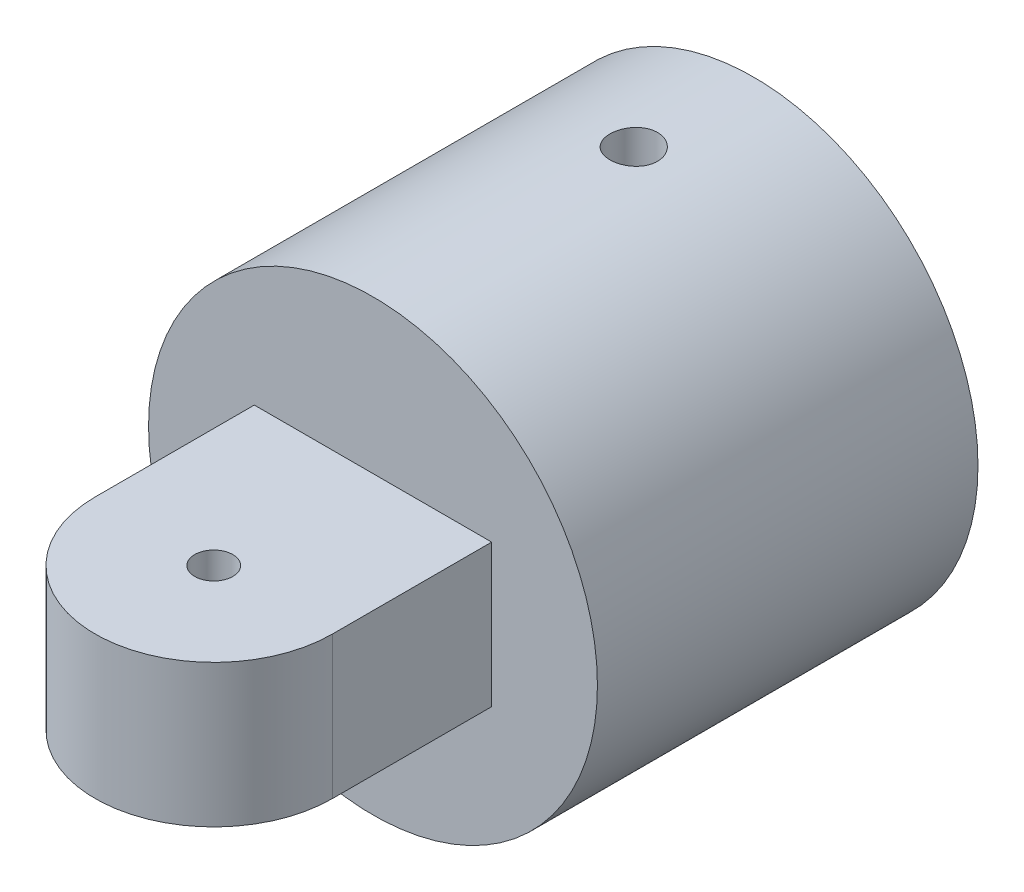
ISO-10303-21;
HEADER;
FILE_DESCRIPTION(('STEP AP214'),'2;1');
FILE_NAME('part.step','',(''),(''),'','','');
FILE_SCHEMA(('AUTOMOTIVE_DESIGN { 1 0 10303 214 1 1 1 1 }'));
ENDSEC;
DATA;
#1=APPLICATION_CONTEXT('core data for automotive mechanical design processes');
#2=APPLICATION_PROTOCOL_DEFINITION('international standard','automotive_design',2000,#1);
#3=PRODUCT_CONTEXT('',#1,'mechanical');
#4=PRODUCT('Part','Part','',(#3));
#5=PRODUCT_RELATED_PRODUCT_CATEGORY('part','',(#4));
#6=PRODUCT_DEFINITION_FORMATION('','',#4);
#7=PRODUCT_DEFINITION_CONTEXT('part definition',#1,'design');
#8=PRODUCT_DEFINITION('design','',#6,#7);
#9=PRODUCT_DEFINITION_SHAPE('','',#8);
#10=(LENGTH_UNIT() NAMED_UNIT(*) SI_UNIT(.MILLI.,.METRE.));
#11=(NAMED_UNIT(*) PLANE_ANGLE_UNIT() SI_UNIT($,.RADIAN.));
#12=(NAMED_UNIT(*) SI_UNIT($,.STERADIAN.) SOLID_ANGLE_UNIT());
#13=UNCERTAINTY_MEASURE_WITH_UNIT(LENGTH_MEASURE(1.E-05),#10,'distance_accuracy_value','');
#14=(GEOMETRIC_REPRESENTATION_CONTEXT(3) GLOBAL_UNCERTAINTY_ASSIGNED_CONTEXT((#13)) GLOBAL_UNIT_ASSIGNED_CONTEXT((#10,
#11,#12)) REPRESENTATION_CONTEXT('',''));
#15=CARTESIAN_POINT('',(0.,0.,0.));
#16=DIRECTION('',(0.,0.,1.));
#17=DIRECTION('',(1.,0.,0.));
#18=AXIS2_PLACEMENT_3D('',#15,#16,#17);
#19=CARTESIAN_POINT('',(0.,7.49,46.7347256348819));
#20=DIRECTION('',(0.,-1.,0.));
#21=DIRECTION('',(0.,0.,-1.));
#22=AXIS2_PLACEMENT_3D('',#19,#20,#21);
#23=CYLINDRICAL_SURFACE('',#22,12.4735073454206);
#24=CARTESIAN_POINT('',(0.,-7.49,46.7347256348819));
#25=DIRECTION('',(0.,1.,0.));
#26=DIRECTION('',(0.,0.,1.));
#27=AXIS2_PLACEMENT_3D('',#24,#25,#26);
#28=CIRCLE('',#27,12.4735073454206);
#29=CARTESIAN_POINT('',(-12.4735073454206,-7.49,46.7347256348819));
#30=VERTEX_POINT('',#29);
#31=CARTESIAN_POINT('',(12.4735073454206,-7.49,46.7347256348819));
#32=VERTEX_POINT('',#31);
#33=EDGE_CURVE('E107',#30,#32,#28,.T.);
#34=ORIENTED_EDGE('',*,*,#33,.T.);
#35=DIRECTION('',(0.,-1.,0.));
#36=VECTOR('',#35,1.);
#37=CARTESIAN_POINT('',(12.4735073454206,7.49,46.7347256348819));
#38=LINE('',#37,#36);
#39=CARTESIAN_POINT('',(12.4735073454206,7.49,46.7347256348819));
#40=VERTEX_POINT('',#39);
#41=EDGE_CURVE('E12',#40,#32,#38,.T.);
#42=ORIENTED_EDGE('',*,*,#41,.F.);
#43=CARTESIAN_POINT('',(0.,7.49,46.7347256348819));
#44=DIRECTION('',(0.,1.,0.));
#45=DIRECTION('',(0.,0.,1.));
#46=AXIS2_PLACEMENT_3D('',#43,#44,#45);
#47=CIRCLE('',#46,12.4735073454206);
#48=CARTESIAN_POINT('',(-12.4735073454206,7.49,46.7347256348819));
#49=VERTEX_POINT('',#48);
#50=EDGE_CURVE('E94',#49,#40,#47,.T.);
#51=ORIENTED_EDGE('',*,*,#50,.F.);
#52=DIRECTION('',(0.,-1.,0.));
#53=VECTOR('',#52,1.);
#54=CARTESIAN_POINT('',(-12.4735073454206,7.49,46.7347256348819));
#55=LINE('',#54,#53);
#56=EDGE_CURVE('E103',#49,#30,#55,.T.);
#57=ORIENTED_EDGE('',*,*,#56,.T.);
#58=EDGE_LOOP('',(#34,#42,#51,#57));
#59=FACE_BOUND('',#58,.T.);
#60=ADVANCED_FACE('F42',(#59),#23,.T.);
#61=CARTESIAN_POINT('',(12.4735073454206,7.49,46.7347256348819));
#62=DIRECTION('',(-1.,0.,0.));
#63=DIRECTION('',(0.,0.,1.));
#64=AXIS2_PLACEMENT_3D('',#61,#62,#63);
#65=PLANE('',#64);
#66=DIRECTION('',(0.,0.,-1.));
#67=VECTOR('',#66,1.);
#68=CARTESIAN_POINT('',(12.4735073454206,-7.49,46.7347256348819));
#69=LINE('',#68,#67);
#70=CARTESIAN_POINT('',(12.4735073454206,-7.49,30.));
#71=VERTEX_POINT('',#70);
#72=EDGE_CURVE('E98',#32,#71,#69,.T.);
#73=ORIENTED_EDGE('',*,*,#72,.T.);
#74=DIRECTION('',(0.,-1.,0.));
#75=VECTOR('',#74,1.);
#76=CARTESIAN_POINT('',(12.4735073454206,7.49,30.));
#77=LINE('',#76,#75);
#78=CARTESIAN_POINT('',(12.4735073454206,7.49,30.));
#79=VERTEX_POINT('',#78);
#80=EDGE_CURVE('E51',#79,#71,#77,.T.);
#81=ORIENTED_EDGE('',*,*,#80,.F.);
#82=DIRECTION('',(0.,0.,-1.));
#83=VECTOR('',#82,1.);
#84=CARTESIAN_POINT('',(12.4735073454206,7.49,46.7347256348819));
#85=LINE('',#84,#83);
#86=EDGE_CURVE('E89',#40,#79,#85,.T.);
#87=ORIENTED_EDGE('',*,*,#86,.F.);
#88=ORIENTED_EDGE('',*,*,#41,.T.);
#89=EDGE_LOOP('',(#73,#81,#87,#88));
#90=FACE_BOUND('',#89,.T.);
#91=ADVANCED_FACE('F97',(#90),#65,.F.);
#92=CARTESIAN_POINT('',(-12.4735073454206,7.49,30.));
#93=DIRECTION('',(0.,0.,1.));
#94=DIRECTION('',(1.,0.,0.));
#95=AXIS2_PLACEMENT_3D('',#92,#93,#94);
#96=PLANE('',#95);
#97=DIRECTION('',(-1.,0.,0.));
#98=VECTOR('',#97,1.);
#99=CARTESIAN_POINT('',(-12.4735073454206,-7.49,30.));
#100=LINE('',#99,#98);
#101=CARTESIAN_POINT('',(-12.4735073454206,-7.49,30.));
#102=VERTEX_POINT('',#101);
#103=EDGE_CURVE('E76',#71,#102,#100,.T.);
#104=ORIENTED_EDGE('',*,*,#103,.T.);
#105=DIRECTION('',(0.,-1.,0.));
#106=VECTOR('',#105,1.);
#107=CARTESIAN_POINT('',(-12.4735073454206,7.49,30.));
#108=LINE('',#107,#106);
#109=CARTESIAN_POINT('',(-12.4735073454206,7.49,30.));
#110=VERTEX_POINT('',#109);
#111=EDGE_CURVE('E99',#110,#102,#108,.T.);
#112=ORIENTED_EDGE('',*,*,#111,.F.);
#113=DIRECTION('',(-1.,0.,0.));
#114=VECTOR('',#113,1.);
#115=CARTESIAN_POINT('',(-12.4735073454206,7.49,30.));
#116=LINE('',#115,#114);
#117=EDGE_CURVE('E92',#79,#110,#116,.T.);
#118=ORIENTED_EDGE('',*,*,#117,.F.);
#119=ORIENTED_EDGE('',*,*,#80,.T.);
#120=EDGE_LOOP('',(#104,#112,#118,#119));
#121=FACE_BOUND('',#120,.T.);
#122=ADVANCED_FACE('F101',(#121),#96,.F.);
#123=CARTESIAN_POINT('',(-12.4735073454206,7.49,30.));
#124=DIRECTION('',(1.,0.,0.));
#125=DIRECTION('',(0.,0.,-1.));
#126=AXIS2_PLACEMENT_3D('',#123,#124,#125);
#127=PLANE('',#126);
#128=DIRECTION('',(0.,0.,1.));
#129=VECTOR('',#128,1.);
#130=CARTESIAN_POINT('',(-12.4735073454206,-7.49,30.));
#131=LINE('',#130,#129);
#132=EDGE_CURVE('E82',#102,#30,#131,.T.);
#133=ORIENTED_EDGE('',*,*,#132,.T.);
#134=ORIENTED_EDGE('',*,*,#56,.F.);
#135=DIRECTION('',(0.,0.,1.));
#136=VECTOR('',#135,1.);
#137=CARTESIAN_POINT('',(-12.4735073454206,7.49,30.));
#138=LINE('',#137,#136);
#139=EDGE_CURVE('E59',#110,#49,#138,.T.);
#140=ORIENTED_EDGE('',*,*,#139,.F.);
#141=ORIENTED_EDGE('',*,*,#111,.T.);
#142=EDGE_LOOP('',(#133,#134,#140,#141));
#143=FACE_BOUND('',#142,.T.);
#144=ADVANCED_FACE('F115',(#143),#127,.F.);
#145=CARTESIAN_POINT('',(0.,7.49,46.7347256348819));
#146=DIRECTION('',(0.,1.,0.));
#147=DIRECTION('',(0.,0.,1.));
#148=AXIS2_PLACEMENT_3D('',#145,#146,#147);
#149=PLANE('',#148);
#150=CARTESIAN_POINT('',(0.,7.49,46.7347256348819));
#151=DIRECTION('',(0.,1.,0.));
#152=DIRECTION('',(0.,0.,1.));
#153=AXIS2_PLACEMENT_3D('',#150,#151,#152);
#154=CIRCLE('',#153,2.);
#155=CARTESIAN_POINT('',(0.,7.49,48.7347256348819));
#156=VERTEX_POINT('',#155);
#157=EDGE_CURVE('E110',#156,#156,#154,.T.);
#158=ORIENTED_EDGE('',*,*,#157,.F.);
#159=EDGE_LOOP('',(#158));
#160=FACE_BOUND('',#159,.T.);
#161=ORIENTED_EDGE('',*,*,#50,.T.);
#162=ORIENTED_EDGE('',*,*,#86,.T.);
#163=ORIENTED_EDGE('',*,*,#117,.T.);
#164=ORIENTED_EDGE('',*,*,#139,.T.);
#165=EDGE_LOOP('',(#161,#162,#163,#164));
#166=FACE_BOUND('',#165,.T.);
#167=ADVANCED_FACE('F90',(#160,#166),#149,.T.);
#168=CARTESIAN_POINT('',(0.,-7.49,46.7347256348819));
#169=DIRECTION('',(0.,1.,0.));
#170=DIRECTION('',(0.,0.,1.));
#171=AXIS2_PLACEMENT_3D('',#168,#169,#170);
#172=PLANE('',#171);
#173=CARTESIAN_POINT('',(0.,-7.49,46.7347256348819));
#174=DIRECTION('',(0.,1.,0.));
#175=DIRECTION('',(0.,0.,1.));
#176=AXIS2_PLACEMENT_3D('',#173,#174,#175);
#177=CIRCLE('',#176,2.);
#178=CARTESIAN_POINT('',(0.,-7.49,48.7347256348819));
#179=VERTEX_POINT('',#178);
#180=EDGE_CURVE('E45',#179,#179,#177,.T.);
#181=ORIENTED_EDGE('',*,*,#180,.T.);
#182=EDGE_LOOP('',(#181));
#183=FACE_BOUND('',#182,.T.);
#184=ORIENTED_EDGE('',*,*,#33,.F.);
#185=ORIENTED_EDGE('',*,*,#132,.F.);
#186=ORIENTED_EDGE('',*,*,#103,.F.);
#187=ORIENTED_EDGE('',*,*,#72,.F.);
#188=EDGE_LOOP('',(#184,#185,#186,#187));
#189=FACE_BOUND('',#188,.T.);
#190=ADVANCED_FACE('F118',(#183,#189),#172,.F.);
#191=CARTESIAN_POINT('',(0.,-30.01,46.7347256348819));
#192=DIRECTION('',(0.,1.,0.));
#193=DIRECTION('',(0.,0.,1.));
#194=AXIS2_PLACEMENT_3D('',#191,#192,#193);
#195=CYLINDRICAL_SURFACE('',#194,2.);
#196=ORIENTED_EDGE('',*,*,#157,.T.);
#197=EDGE_LOOP('',(#196));
#198=FACE_BOUND('',#197,.T.);
#199=ORIENTED_EDGE('',*,*,#180,.F.);
#200=EDGE_LOOP('',(#199));
#201=FACE_BOUND('',#200,.T.);
#202=ADVANCED_FACE('F128',(#198,#201),#195,.F.);
#203=CLOSED_SHELL('',(#60,#91,#122,#144,#167,#190,#202));
#204=MANIFOLD_SOLID_BREP('B2',#203);
#205=CARTESIAN_POINT('',(0.,0.,-10.));
#206=DIRECTION('',(0.,0.,1.));
#207=DIRECTION('',(1.,0.,0.));
#208=AXIS2_PLACEMENT_3D('',#205,#206,#207);
#209=CYLINDRICAL_SURFACE('',#208,23.59);
#210=CARTESIAN_POINT('',(0.,-23.59,5.09265528024894));
#211=CARTESIAN_POINT('',(-0.140004890382727,-23.5899983030771,5.09264924055201));
#212=CARTESIAN_POINT('',(-0.280101235515981,-23.5887403958274,5.08085484903469));
#213=CARTESIAN_POINT('',(-0.556406756116709,-23.5838433207522,5.03398453755704));
#214=CARTESIAN_POINT('',(-0.69261152926387,-23.5802015594957,4.99888326108428));
#215=CARTESIAN_POINT('',(-0.957092956934866,-23.5709476853588,4.90643525755362));
#216=CARTESIAN_POINT('',(-1.0853744636063,-23.5653367927148,4.84910230477494));
#217=CARTESIAN_POINT('',(-1.33046665616082,-23.552771315274,4.7138459386785));
#218=CARTESIAN_POINT('',(-1.447279548038,-23.545816989654,4.63592649586781));
#219=CARTESIAN_POINT('',(-1.66661511804326,-23.5313118555805,4.46137336041841));
#220=CARTESIAN_POINT('',(-1.76908519934517,-23.5237590029897,4.36467374054453));
#221=CARTESIAN_POINT('',(-1.95637410950071,-23.5089248770597,4.15544610059121));
#222=CARTESIAN_POINT('',(-2.04119210452785,-23.501643616563,4.04291733321549));
#223=CARTESIAN_POINT('',(-2.19095784039705,-23.4881564147091,3.80489335893848));
#224=CARTESIAN_POINT('',(-2.25585757467481,-23.4819530867172,3.67936778530447));
#225=CARTESIAN_POINT('',(-2.36363798842801,-23.4713498936534,3.41912356710732));
#226=CARTESIAN_POINT('',(-2.40651927501024,-23.4669499788572,3.28440517613049));
#227=CARTESIAN_POINT('',(-2.46888865123076,-23.4604705499611,3.01013837871538));
#228=CARTESIAN_POINT('',(-2.48846438567586,-23.4583823443468,2.87061011186612));
#229=CARTESIAN_POINT('',(-2.50393796281383,-23.4567358887997,2.59023409604559));
#230=CARTESIAN_POINT('',(-2.49983649980298,-23.4571775646821,2.44938638588582));
#231=CARTESIAN_POINT('',(-2.46814427950293,-23.4605330256352,2.17097524294631));
#232=CARTESIAN_POINT('',(-2.44064940226408,-23.4634367197314,2.03340075715007));
#233=CARTESIAN_POINT('',(-2.36310010922259,-23.4713732901132,1.76482990985994));
#234=CARTESIAN_POINT('',(-2.31304535499427,-23.4764061983395,1.63383364708019));
#235=CARTESIAN_POINT('',(-2.19169195639642,-23.4880456955699,1.3818359671456));
#236=CARTESIAN_POINT('',(-2.12035096524796,-23.4946554161757,1.26085509326867));
#237=CARTESIAN_POINT('',(-1.95848059921138,-23.5087011989002,1.03254726176001));
#238=CARTESIAN_POINT('',(-1.86795059325972,-23.5161372881916,0.925220753361215));
#239=CARTESIAN_POINT('',(-1.66973740575721,-23.5310428996824,0.726711240644872));
#240=CARTESIAN_POINT('',(-1.56197145460676,-23.538512404975,0.63561086068373));
#241=CARTESIAN_POINT('',(-1.3326323311139,-23.5526085089759,0.472780651845098));
#242=CARTESIAN_POINT('',(-1.21105914024982,-23.5592351065534,0.401050848952615));
#243=CARTESIAN_POINT('',(-0.95749788958243,-23.5709013286536,0.27900051713335));
#244=CARTESIAN_POINT('',(-0.825507692564153,-23.5759406264525,0.22868439517165));
#245=CARTESIAN_POINT('',(-0.554887088841686,-23.583861220576,0.150951369049361));
#246=CARTESIAN_POINT('',(-0.416256905405358,-23.5867425894063,0.123533695504974));
#247=CARTESIAN_POINT('',(-0.13700681251426,-23.5900133370954,0.0924811689670743));
#248=CARTESIAN_POINT('',(0.00360028917354455,-23.5904146578676,0.0887323439707742));
#249=CARTESIAN_POINT('',(0.283440751422993,-23.5887121615328,0.104824272167669));
#250=CARTESIAN_POINT('',(0.422674132839351,-23.5866083825154,0.124664666691008));
#251=CARTESIAN_POINT('',(0.695484265843108,-23.5801396699159,0.18727725423791));
#252=CARTESIAN_POINT('',(0.82907345030202,-23.5757800202398,0.229995867960536));
#253=CARTESIAN_POINT('',(1.08719009199438,-23.5652884237549,0.337097067031888));
#254=CARTESIAN_POINT('',(1.21171732245822,-23.5591564326133,0.401480194294606));
#255=CARTESIAN_POINT('',(1.44868911728913,-23.5457757711934,0.550363955467738));
#256=CARTESIAN_POINT('',(1.5610865587743,-23.5385229945229,0.634939217734632));
#257=CARTESIAN_POINT('',(1.77013069103516,-23.52372718167,0.821699778434905));
#258=CARTESIAN_POINT('',(1.86677693664698,-23.5161841372913,0.923885574413334));
#259=CARTESIAN_POINT('',(2.04197287593517,-23.5016218005983,1.14346488094225));
#260=CARTESIAN_POINT('',(2.12044760211723,-23.4946047560305,1.26091837610957));
#261=CARTESIAN_POINT('',(2.25655697915346,-23.4819237546767,1.50740420436788));
#262=CARTESIAN_POINT('',(2.31419194505344,-23.4762597774361,1.63643636238121));
#263=CARTESIAN_POINT('',(2.40686115244347,-23.4669405565708,1.90216301244972));
#264=CARTESIAN_POINT('',(2.44193948508609,-23.4632813962425,2.03884198511199));
#265=CARTESIAN_POINT('',(2.48864252138218,-23.4583741704025,2.31619086426492));
#266=CARTESIAN_POINT('',(2.50026798822697,-23.4571260264327,2.45686064073779));
#267=CARTESIAN_POINT('',(2.49972395442828,-23.4571839502349,2.73745278195374));
#268=CARTESIAN_POINT('',(2.48767221595611,-23.4584773771247,2.87737539246933));
#269=CARTESIAN_POINT('',(2.44036333007009,-23.4634457046064,3.15319587166051));
#270=CARTESIAN_POINT('',(2.40510616101156,-23.4671206074198,3.28909373658193));
#271=CARTESIAN_POINT('',(2.31242071265327,-23.4764342239078,3.55300292855398));
#272=CARTESIAN_POINT('',(2.25499638901096,-23.4820725871918,3.68101565795841));
#273=CARTESIAN_POINT('',(2.11961864177243,-23.4946785069669,3.9256051537143));
#274=CARTESIAN_POINT('',(2.04166525062716,-23.5016460613569,4.04218193814251));
#275=CARTESIAN_POINT('',(1.86700081845345,-23.5161668347073,4.2611937293086));
#276=CARTESIAN_POINT('',(1.77020196065382,-23.5237226921116,4.36355852869407));
#277=CARTESIAN_POINT('',(1.56077124206543,-23.538544757639,4.55064161485833));
#278=CARTESIAN_POINT('',(1.44813560849441,-23.5458108962116,4.63535568474797));
#279=CARTESIAN_POINT('',(1.20987998501282,-23.5592562744924,4.78492279755493));
#280=CARTESIAN_POINT('',(1.08422463280158,-23.5654324240323,4.84971974786155));
#281=CARTESIAN_POINT('',(0.82382941268191,-23.5759690180188,4.95720631284111));
#282=CARTESIAN_POINT('',(0.689099898452413,-23.5803314924243,4.99992065662569));
#283=CARTESIAN_POINT('',(0.461351179347136,-23.5856627304559,5.05147129320623));
#284=CARTESIAN_POINT('',(0.369783882248667,-23.5872815484788,5.06689395058982));
#285=CARTESIAN_POINT('',(0.185491103341335,-23.5894507428818,5.08748792056352));
#286=CARTESIAN_POINT('',(0.092765627062525,-23.5900011243616,5.09265928208253));
#287=CARTESIAN_POINT('',(0.,-23.59,5.09265528024894));
#288=B_SPLINE_CURVE_WITH_KNOTS('',3,(#210,#211,#212,#213,#214,#215,#216,#217,#218,#219,#220,
#221,#222,#223,#224,#225,#226,#227,#228,#229,#230,#231,#232,#233,#234,#235,#236,#237,#238,#239,
#240,#241,#242,#243,#244,#245,#246,#247,#248,#249,#250,#251,#252,#253,#254,#255,#256,#257,#258,
#259,#260,#261,#262,#263,#264,#265,#266,#267,#268,#269,#270,#271,#272,#273,#274,#275,#276,#277,
#278,#279,#280,#281,#282,#283,#284,#285,#286,#287),.UNSPECIFIED.,.T.,.F.,(4,2,2,2,2,2,2,2,2,2,2,
2,2,2,2,2,2,2,2,2,2,2,2,2,2,2,2,2,2,2,2,2,2,2,2,2,2,2,4),(0.,0.41967590487986,0.839809142071956,
1.25968248839799,1.67947491298238,2.10076854982229,2.52208208267318,2.94440322328858,
3.36671271876888,3.78742897392592,4.2081328923083,4.62712077768863,5.04611494860777,
5.46594828694184,5.88579543435547,6.30772288072299,6.72965089308983,7.15166569688249,
7.57366632048221,7.993633335554,8.41359396518424,8.8325753478515,9.25156721165667,
9.67213228156076,10.0927092355103,10.5149915581614,10.9372674966777,11.3587154885586,
11.7801497656706,12.1994932813853,12.6188371882399,13.038106299089,13.4573747471904,
13.878645816124,14.3000174147048,14.7225650736196,15.1446385137549,15.4227122595513,
15.7007846781132),.UNSPECIFIED.);
#289=CARTESIAN_POINT('',(0.,-23.59,5.09265528024894));
#290=VERTEX_POINT('',#289);
#291=EDGE_CURVE('E41',#290,#290,#288,.T.);
#292=ORIENTED_EDGE('',*,*,#291,.F.);
#293=EDGE_LOOP('',(#292));
#294=FACE_BOUND('',#293,.T.);
#295=CARTESIAN_POINT('',(0.,23.59,5.09265528024894));
#296=CARTESIAN_POINT('',(0.140004890382727,23.5899983030771,5.09264924055201));
#297=CARTESIAN_POINT('',(0.280101235515981,23.5887403958274,5.08085484903469));
#298=CARTESIAN_POINT('',(0.556406756116709,23.5838433207522,5.03398453755704));
#299=CARTESIAN_POINT('',(0.69261152926387,23.5802015594957,4.99888326108428));
#300=CARTESIAN_POINT('',(0.957092956934866,23.5709476853588,4.90643525755362));
#301=CARTESIAN_POINT('',(1.0853744636063,23.5653367927148,4.84910230477494));
#302=CARTESIAN_POINT('',(1.33046665616082,23.552771315274,4.7138459386785));
#303=CARTESIAN_POINT('',(1.447279548038,23.545816989654,4.63592649586781));
#304=CARTESIAN_POINT('',(1.66661511804326,23.5313118555805,4.46137336041841));
#305=CARTESIAN_POINT('',(1.76908519934517,23.5237590029897,4.36467374054453));
#306=CARTESIAN_POINT('',(1.95637410950071,23.5089248770597,4.15544610059121));
#307=CARTESIAN_POINT('',(2.04119210452785,23.501643616563,4.04291733321549));
#308=CARTESIAN_POINT('',(2.19095784039705,23.4881564147091,3.80489335893848));
#309=CARTESIAN_POINT('',(2.25585757467481,23.4819530867172,3.67936778530447));
#310=CARTESIAN_POINT('',(2.36363798842801,23.4713498936534,3.41912356710732));
#311=CARTESIAN_POINT('',(2.40651927501024,23.4669499788572,3.28440517613049));
#312=CARTESIAN_POINT('',(2.46888865123076,23.4604705499611,3.01013837871538));
#313=CARTESIAN_POINT('',(2.48846438567586,23.4583823443468,2.87061011186612));
#314=CARTESIAN_POINT('',(2.50393796281383,23.4567358887997,2.59023409604559));
#315=CARTESIAN_POINT('',(2.49983649980298,23.4571775646821,2.44938638588582));
#316=CARTESIAN_POINT('',(2.46814427950293,23.4605330256352,2.17097524294631));
#317=CARTESIAN_POINT('',(2.44064940226408,23.4634367197314,2.03340075715007));
#318=CARTESIAN_POINT('',(2.36310010922259,23.4713732901132,1.76482990985994));
#319=CARTESIAN_POINT('',(2.31304535499427,23.4764061983395,1.63383364708019));
#320=CARTESIAN_POINT('',(2.19169195639642,23.4880456955699,1.3818359671456));
#321=CARTESIAN_POINT('',(2.12035096524796,23.4946554161757,1.26085509326867));
#322=CARTESIAN_POINT('',(1.95848059921138,23.5087011989002,1.03254726176001));
#323=CARTESIAN_POINT('',(1.86795059325972,23.5161372881916,0.925220753361215));
#324=CARTESIAN_POINT('',(1.66973740575721,23.5310428996824,0.726711240644872));
#325=CARTESIAN_POINT('',(1.56197145460676,23.538512404975,0.63561086068373));
#326=CARTESIAN_POINT('',(1.3326323311139,23.5526085089759,0.472780651845098));
#327=CARTESIAN_POINT('',(1.21105914024982,23.5592351065534,0.401050848952615));
#328=CARTESIAN_POINT('',(0.95749788958243,23.5709013286536,0.27900051713335));
#329=CARTESIAN_POINT('',(0.825507692564153,23.5759406264525,0.22868439517165));
#330=CARTESIAN_POINT('',(0.554887088841686,23.583861220576,0.150951369049361));
#331=CARTESIAN_POINT('',(0.416256905405358,23.5867425894063,0.123533695504974));
#332=CARTESIAN_POINT('',(0.13700681251426,23.5900133370954,0.0924811689670743));
#333=CARTESIAN_POINT('',(-0.00360028917354455,23.5904146578676,0.0887323439707742));
#334=CARTESIAN_POINT('',(-0.283440751422993,23.5887121615328,0.104824272167669));
#335=CARTESIAN_POINT('',(-0.422674132839351,23.5866083825154,0.124664666691008));
#336=CARTESIAN_POINT('',(-0.695484265843108,23.5801396699159,0.18727725423791));
#337=CARTESIAN_POINT('',(-0.82907345030202,23.5757800202398,0.229995867960536));
#338=CARTESIAN_POINT('',(-1.08719009199438,23.5652884237549,0.337097067031888));
#339=CARTESIAN_POINT('',(-1.21171732245822,23.5591564326133,0.401480194294606));
#340=CARTESIAN_POINT('',(-1.44868911728913,23.5457757711934,0.550363955467738));
#341=CARTESIAN_POINT('',(-1.5610865587743,23.5385229945229,0.634939217734632));
#342=CARTESIAN_POINT('',(-1.77013069103516,23.52372718167,0.821699778434905));
#343=CARTESIAN_POINT('',(-1.86677693664698,23.5161841372913,0.923885574413334));
#344=CARTESIAN_POINT('',(-2.04197287593517,23.5016218005983,1.14346488094225));
#345=CARTESIAN_POINT('',(-2.12044760211723,23.4946047560305,1.26091837610957));
#346=CARTESIAN_POINT('',(-2.25655697915346,23.4819237546767,1.50740420436788));
#347=CARTESIAN_POINT('',(-2.31419194505344,23.4762597774361,1.63643636238121));
#348=CARTESIAN_POINT('',(-2.40686115244347,23.4669405565708,1.90216301244972));
#349=CARTESIAN_POINT('',(-2.44193948508609,23.4632813962425,2.03884198511199));
#350=CARTESIAN_POINT('',(-2.48864252138218,23.4583741704025,2.31619086426492));
#351=CARTESIAN_POINT('',(-2.50026798822697,23.4571260264327,2.45686064073779));
#352=CARTESIAN_POINT('',(-2.49972395442828,23.4571839502349,2.73745278195374));
#353=CARTESIAN_POINT('',(-2.48767221595611,23.4584773771247,2.87737539246933));
#354=CARTESIAN_POINT('',(-2.44036333007009,23.4634457046064,3.15319587166051));
#355=CARTESIAN_POINT('',(-2.40510616101156,23.4671206074198,3.28909373658193));
#356=CARTESIAN_POINT('',(-2.31242071265327,23.4764342239078,3.55300292855398));
#357=CARTESIAN_POINT('',(-2.25499638901096,23.4820725871918,3.68101565795841));
#358=CARTESIAN_POINT('',(-2.11961864177243,23.4946785069669,3.9256051537143));
#359=CARTESIAN_POINT('',(-2.04166525062716,23.5016460613569,4.04218193814251));
#360=CARTESIAN_POINT('',(-1.86700081845345,23.5161668347073,4.2611937293086));
#361=CARTESIAN_POINT('',(-1.77020196065382,23.5237226921116,4.36355852869407));
#362=CARTESIAN_POINT('',(-1.56077124206543,23.538544757639,4.55064161485833));
#363=CARTESIAN_POINT('',(-1.44813560849441,23.5458108962116,4.63535568474797));
#364=CARTESIAN_POINT('',(-1.20987998501282,23.5592562744924,4.78492279755493));
#365=CARTESIAN_POINT('',(-1.08422463280158,23.5654324240323,4.84971974786155));
#366=CARTESIAN_POINT('',(-0.82382941268191,23.5759690180188,4.95720631284111));
#367=CARTESIAN_POINT('',(-0.689099898452413,23.5803314924243,4.99992065662569));
#368=CARTESIAN_POINT('',(-0.461351179347136,23.5856627304559,5.05147129320623));
#369=CARTESIAN_POINT('',(-0.369783882248667,23.5872815484788,5.06689395058982));
#370=CARTESIAN_POINT('',(-0.185491103341335,23.5894507428818,5.08748792056352));
#371=CARTESIAN_POINT('',(-0.092765627062525,23.5900011243616,5.09265928208253));
#372=CARTESIAN_POINT('',(0.,23.59,5.09265528024894));
#373=B_SPLINE_CURVE_WITH_KNOTS('',3,(#295,#296,#297,#298,#299,#300,#301,#302,#303,#304,#305,
#306,#307,#308,#309,#310,#311,#312,#313,#314,#315,#316,#317,#318,#319,#320,#321,#322,#323,#324,
#325,#326,#327,#328,#329,#330,#331,#332,#333,#334,#335,#336,#337,#338,#339,#340,#341,#342,#343,
#344,#345,#346,#347,#348,#349,#350,#351,#352,#353,#354,#355,#356,#357,#358,#359,#360,#361,#362,
#363,#364,#365,#366,#367,#368,#369,#370,#371,#372),.UNSPECIFIED.,.T.,.F.,(4,2,2,2,2,2,2,2,2,2,2,
2,2,2,2,2,2,2,2,2,2,2,2,2,2,2,2,2,2,2,2,2,2,2,2,2,2,2,4),(0.,0.41967590487986,0.839809142071956,
1.25968248839799,1.67947491298238,2.10076854982229,2.52208208267318,2.94440322328858,
3.36671271876888,3.78742897392592,4.2081328923083,4.62712077768863,5.04611494860777,
5.46594828694184,5.88579543435547,6.30772288072299,6.72965089308983,7.15166569688249,
7.57366632048221,7.993633335554,8.41359396518424,8.8325753478515,9.25156721165667,
9.67213228156076,10.0927092355103,10.5149915581614,10.9372674966777,11.3587154885586,
11.7801497656706,12.1994932813853,12.6188371882399,13.038106299089,13.4573747471904,
13.878645816124,14.3000174147048,14.7225650736196,15.1446385137549,15.4227122595513,
15.7007846781132),.UNSPECIFIED.);
#374=CARTESIAN_POINT('',(0.,23.59,5.09265528024894));
#375=VERTEX_POINT('',#374);
#376=EDGE_CURVE('E197',#375,#375,#373,.T.);
#377=ORIENTED_EDGE('',*,*,#376,.F.);
#378=EDGE_LOOP('',(#377));
#379=FACE_BOUND('',#378,.T.);
#380=CARTESIAN_POINT('',(0.,0.,-10.));
#381=DIRECTION('',(0.,0.,1.));
#382=DIRECTION('',(1.,0.,0.));
#383=AXIS2_PLACEMENT_3D('',#380,#381,#382);
#384=CIRCLE('',#383,23.59);
#385=CARTESIAN_POINT('',(23.59,0.,-10.));
#386=VERTEX_POINT('',#385);
#387=EDGE_CURVE('E201',#386,#386,#384,.T.);
#388=ORIENTED_EDGE('',*,*,#387,.T.);
#389=EDGE_LOOP('',(#388));
#390=FACE_BOUND('',#389,.T.);
#391=CARTESIAN_POINT('',(0.,0.,30.));
#392=DIRECTION('',(0.,0.,1.));
#393=DIRECTION('',(1.,0.,0.));
#394=AXIS2_PLACEMENT_3D('',#391,#392,#393);
#395=CIRCLE('',#394,23.59);
#396=CARTESIAN_POINT('',(23.59,0.,30.));
#397=VERTEX_POINT('',#396);
#398=EDGE_CURVE('E205',#397,#397,#395,.T.);
#399=ORIENTED_EDGE('',*,*,#398,.F.);
#400=EDGE_LOOP('',(#399));
#401=FACE_BOUND('',#400,.T.);
#402=ADVANCED_FACE('F186',(#294,#379,#390,#401),#209,.T.);
#403=CARTESIAN_POINT('',(0.,0.,-10.));
#404=DIRECTION('',(0.,0.,1.));
#405=DIRECTION('',(1.,0.,0.));
#406=AXIS2_PLACEMENT_3D('',#403,#404,#405);
#407=PLANE('',#406);
#408=ORIENTED_EDGE('',*,*,#387,.F.);
#409=EDGE_LOOP('',(#408));
#410=FACE_BOUND('',#409,.T.);
#411=ADVANCED_FACE('F218',(#410),#407,.F.);
#412=CARTESIAN_POINT('',(0.,0.,30.));
#413=DIRECTION('',(0.,0.,1.));
#414=DIRECTION('',(1.,0.,0.));
#415=AXIS2_PLACEMENT_3D('',#412,#413,#414);
#416=PLANE('',#415);
#417=ORIENTED_EDGE('',*,*,#398,.T.);
#418=EDGE_LOOP('',(#417));
#419=FACE_BOUND('',#418,.T.);
#420=ADVANCED_FACE('F215',(#419),#416,.T.);
#421=CARTESIAN_POINT('',(0.,-23.59,2.59265528024894));
#422=DIRECTION('',(0.,1.,0.));
#423=DIRECTION('',(0.,0.,1.));
#424=AXIS2_PLACEMENT_3D('',#421,#422,#423);
#425=CYLINDRICAL_SURFACE('',#424,2.5);
#426=ORIENTED_EDGE('',*,*,#291,.T.);
#427=EDGE_LOOP('',(#426));
#428=FACE_BOUND('',#427,.T.);
#429=ORIENTED_EDGE('',*,*,#376,.T.);
#430=EDGE_LOOP('',(#429));
#431=FACE_BOUND('',#430,.T.);
#432=ADVANCED_FACE('F211',(#428,#431),#425,.F.);
#433=CLOSED_SHELL('',(#402,#411,#420,#432));
#434=MANIFOLD_SOLID_BREP('B6',#433);
#435=ADVANCED_BREP_SHAPE_REPRESENTATION('',(#18,#204,#434),#14);
#436=SHAPE_DEFINITION_REPRESENTATION(#9,#435);
ENDSEC;
END-ISO-10303-21;
